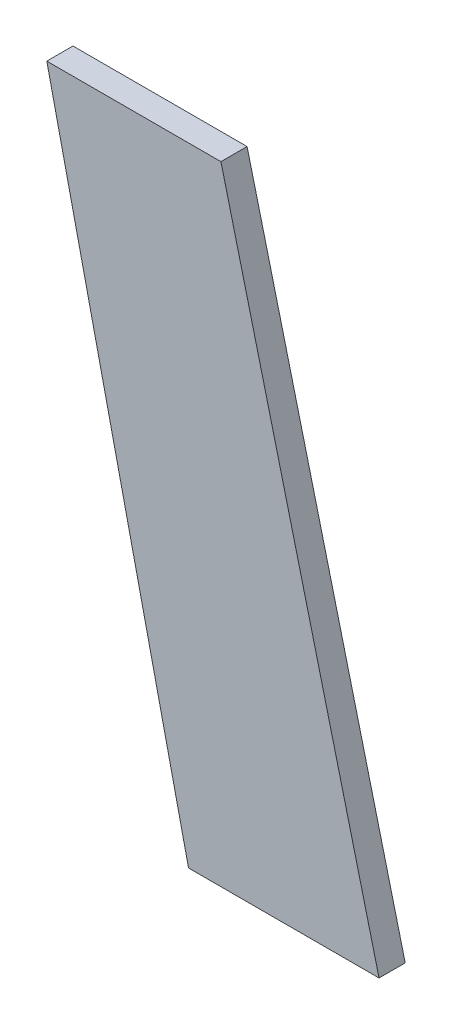
ISO-10303-21;
HEADER;
FILE_DESCRIPTION(('STEP AP214'),'2;1');
FILE_NAME('part.step','',(''),(''),'','','');
FILE_SCHEMA(('AUTOMOTIVE_DESIGN { 1 0 10303 214 1 1 1 1 }'));
ENDSEC;
DATA;
#1=APPLICATION_CONTEXT('core data for automotive mechanical design processes');
#2=APPLICATION_PROTOCOL_DEFINITION('international standard','automotive_design',2000,#1);
#3=PRODUCT_CONTEXT('',#1,'mechanical');
#4=PRODUCT('Part','Part','',(#3));
#5=PRODUCT_RELATED_PRODUCT_CATEGORY('part','',(#4));
#6=PRODUCT_DEFINITION_FORMATION('','',#4);
#7=PRODUCT_DEFINITION_CONTEXT('part definition',#1,'design');
#8=PRODUCT_DEFINITION('design','',#6,#7);
#9=PRODUCT_DEFINITION_SHAPE('','',#8);
#10=(LENGTH_UNIT() NAMED_UNIT(*) SI_UNIT(.MILLI.,.METRE.));
#11=(NAMED_UNIT(*) PLANE_ANGLE_UNIT() SI_UNIT($,.RADIAN.));
#12=(NAMED_UNIT(*) SI_UNIT($,.STERADIAN.) SOLID_ANGLE_UNIT());
#13=UNCERTAINTY_MEASURE_WITH_UNIT(LENGTH_MEASURE(1.E-05),#10,'distance_accuracy_value','');
#14=(GEOMETRIC_REPRESENTATION_CONTEXT(3) GLOBAL_UNCERTAINTY_ASSIGNED_CONTEXT((#13)) GLOBAL_UNIT_ASSIGNED_CONTEXT((#10,
#11,#12)) REPRESENTATION_CONTEXT('',''));
#15=CARTESIAN_POINT('',(0.,0.,0.));
#16=DIRECTION('',(0.,0.,1.));
#17=DIRECTION('',(1.,0.,0.));
#18=AXIS2_PLACEMENT_3D('',#15,#16,#17);
#19=CARTESIAN_POINT('',(16.5064102564092,-12.5,0.5));
#20=DIRECTION('',(0.,1.,0.));
#21=DIRECTION('',(0.,0.,1.));
#22=AXIS2_PLACEMENT_3D('',#19,#20,#21);
#23=PLANE('',#22);
#24=DIRECTION('',(-1.,0.,0.));
#25=VECTOR('',#24,1.);
#26=CARTESIAN_POINT('',(16.5064102564092,-12.5,1.));
#27=LINE('',#26,#25);
#28=CARTESIAN_POINT('',(16.5064102564092,-12.5,1.));
#29=VERTEX_POINT('',#28);
#30=CARTESIAN_POINT('',(12.8655849358964,-12.5,1.));
#31=VERTEX_POINT('',#30);
#32=EDGE_CURVE('E98',#29,#31,#27,.T.);
#33=ORIENTED_EDGE('',*,*,#32,.T.);
#34=DIRECTION('',(0.,0.,1.));
#35=VECTOR('',#34,1.);
#36=CARTESIAN_POINT('',(12.8655849358964,-12.5,0.5));
#37=LINE('',#36,#35);
#38=CARTESIAN_POINT('',(12.8655849358964,-12.5,0.5));
#39=VERTEX_POINT('',#38);
#40=EDGE_CURVE('E81',#39,#31,#37,.T.);
#41=ORIENTED_EDGE('',*,*,#40,.F.);
#42=DIRECTION('',(-1.,0.,0.));
#43=VECTOR('',#42,1.);
#44=CARTESIAN_POINT('',(16.5064102564092,-12.5,0.5));
#45=LINE('',#44,#43);
#46=CARTESIAN_POINT('',(16.5064102564092,-12.5,0.5));
#47=VERTEX_POINT('',#46);
#48=EDGE_CURVE('E93',#47,#39,#45,.T.);
#49=ORIENTED_EDGE('',*,*,#48,.F.);
#50=DIRECTION('',(0.,0.,1.));
#51=VECTOR('',#50,1.);
#52=CARTESIAN_POINT('',(16.5064102564092,-12.5,0.5));
#53=LINE('',#52,#51);
#54=EDGE_CURVE('E102',#47,#29,#53,.T.);
#55=ORIENTED_EDGE('',*,*,#54,.T.);
#56=EDGE_LOOP('',(#33,#41,#49,#55));
#57=FACE_BOUND('',#56,.T.);
#58=ADVANCED_FACE('F39',(#57),#23,.F.);
#59=CARTESIAN_POINT('',(8.58165516531608,6.47238776818213,0.5));
#60=DIRECTION('',(0.,0.,1.));
#61=DIRECTION('',(1.,0.,0.));
#62=AXIS2_PLACEMENT_3D('',#59,#60,#61);
#63=PLANE('',#62);
#64=DIRECTION('',(-0.220169673669664,0.975461590630914,0.));
#65=VECTOR('',#64,1.);
#66=CARTESIAN_POINT('',(12.8655849358964,-12.5,0.5));
#67=LINE('',#66,#65);
#68=CARTESIAN_POINT('',(10.1570866111934,-0.5,0.5));
#69=VERTEX_POINT('',#68);
#70=EDGE_CURVE('E105',#39,#69,#67,.T.);
#71=ORIENTED_EDGE('',*,*,#70,.T.);
#72=DIRECTION('',(1.,0.,0.));
#73=VECTOR('',#72,1.);
#74=CARTESIAN_POINT('',(8.58165516531608,-0.5,0.499999999999922));
#75=LINE('',#74,#73);
#76=CARTESIAN_POINT('',(13.4847756410246,-0.500000000000002,0.500000000000082));
#77=VERTEX_POINT('',#76);
#78=EDGE_CURVE('E76',#69,#77,#75,.T.);
#79=ORIENTED_EDGE('',*,*,#78,.T.);
#80=DIRECTION('',(0.244180745185394,-0.969729737442709,0.));
#81=VECTOR('',#80,1.);
#82=CARTESIAN_POINT('',(10.2113381410246,12.5,0.5));
#83=LINE('',#82,#81);
#84=EDGE_CURVE('E43',#77,#47,#83,.T.);
#85=ORIENTED_EDGE('',*,*,#84,.T.);
#86=ORIENTED_EDGE('',*,*,#48,.T.);
#87=EDGE_LOOP('',(#71,#79,#85,#86));
#88=FACE_BOUND('',#87,.T.);
#89=ADVANCED_FACE('F111',(#88),#63,.F.);
#90=CARTESIAN_POINT('',(12.8655849358964,-12.5,0.5));
#91=DIRECTION('',(0.975461590630914,0.220169673669664,0.));
#92=DIRECTION('',(-0.220169673669664,0.975461590630915,0.));
#93=AXIS2_PLACEMENT_3D('',#90,#91,#92);
#94=PLANE('',#93);
#95=DIRECTION('',(-0.220169673669664,0.975461590630914,0.));
#96=VECTOR('',#95,1.);
#97=CARTESIAN_POINT('',(12.8655849358964,-12.5,1.));
#98=LINE('',#97,#96);
#99=CARTESIAN_POINT('',(10.1570866111934,-0.5,1.));
#100=VERTEX_POINT('',#99);
#101=EDGE_CURVE('E84',#31,#100,#98,.T.);
#102=ORIENTED_EDGE('',*,*,#101,.T.);
#103=DIRECTION('',(0.,0.,-1.));
#104=VECTOR('',#103,1.);
#105=CARTESIAN_POINT('',(10.1570866111934,-0.5,0.5));
#106=LINE('',#105,#104);
#107=EDGE_CURVE('E78',#100,#69,#106,.T.);
#108=ORIENTED_EDGE('',*,*,#107,.T.);
#109=ORIENTED_EDGE('',*,*,#70,.F.);
#110=ORIENTED_EDGE('',*,*,#40,.T.);
#111=EDGE_LOOP('',(#102,#108,#109,#110));
#112=FACE_BOUND('',#111,.T.);
#113=ADVANCED_FACE('F91',(#112),#94,.F.);
#114=CARTESIAN_POINT('',(10.2113381410246,12.5,0.5));
#115=DIRECTION('',(-0.969729737442709,-0.244180745185394,0.));
#116=DIRECTION('',(0.244180745185394,-0.969729737442709,0.));
#117=AXIS2_PLACEMENT_3D('',#114,#115,#116);
#118=PLANE('',#117);
#119=ORIENTED_EDGE('',*,*,#84,.F.);
#120=DIRECTION('',(0.,0.,1.));
#121=VECTOR('',#120,1.);
#122=CARTESIAN_POINT('',(13.4847756410246,-0.5,0.5));
#123=LINE('',#122,#121);
#124=CARTESIAN_POINT('',(13.4847756410246,-0.5,1.));
#125=VERTEX_POINT('',#124);
#126=EDGE_CURVE('E60',#77,#125,#123,.T.);
#127=ORIENTED_EDGE('',*,*,#126,.T.);
#128=DIRECTION('',(0.244180745185394,-0.969729737442709,0.));
#129=VECTOR('',#128,1.);
#130=CARTESIAN_POINT('',(10.2113381410246,12.5,1.));
#131=LINE('',#130,#129);
#132=EDGE_CURVE('E47',#125,#29,#131,.T.);
#133=ORIENTED_EDGE('',*,*,#132,.T.);
#134=ORIENTED_EDGE('',*,*,#54,.F.);
#135=EDGE_LOOP('',(#119,#127,#133,#134));
#136=FACE_BOUND('',#135,.T.);
#137=ADVANCED_FACE('F106',(#136),#118,.F.);
#138=CARTESIAN_POINT('',(8.58165516531608,6.47238776818213,1.));
#139=DIRECTION('',(0.,0.,1.));
#140=DIRECTION('',(1.,0.,0.));
#141=AXIS2_PLACEMENT_3D('',#138,#139,#140);
#142=PLANE('',#141);
#143=ORIENTED_EDGE('',*,*,#132,.F.);
#144=DIRECTION('',(-1.,0.,0.));
#145=VECTOR('',#144,1.);
#146=CARTESIAN_POINT('',(-17.,-0.5,1.));
#147=LINE('',#146,#145);
#148=EDGE_CURVE('E11',#125,#100,#147,.T.);
#149=ORIENTED_EDGE('',*,*,#148,.T.);
#150=ORIENTED_EDGE('',*,*,#101,.F.);
#151=ORIENTED_EDGE('',*,*,#32,.F.);
#152=EDGE_LOOP('',(#143,#149,#150,#151));
#153=FACE_BOUND('',#152,.T.);
#154=ADVANCED_FACE('F41',(#153),#142,.T.);
#155=CARTESIAN_POINT('',(-17.,-0.5,1.));
#156=DIRECTION('',(0.,-1.,0.));
#157=DIRECTION('',(0.,0.,-1.));
#158=AXIS2_PLACEMENT_3D('',#155,#156,#157);
#159=PLANE('',#158);
#160=ORIENTED_EDGE('',*,*,#78,.F.);
#161=ORIENTED_EDGE('',*,*,#107,.F.);
#162=ORIENTED_EDGE('',*,*,#148,.F.);
#163=ORIENTED_EDGE('',*,*,#126,.F.);
#164=EDGE_LOOP('',(#160,#161,#162,#163));
#165=FACE_BOUND('',#164,.T.);
#166=ADVANCED_FACE('F77',(#165),#159,.F.);
#167=CLOSED_SHELL('',(#58,#89,#113,#137,#154,#166));
#168=MANIFOLD_SOLID_BREP('B2',#167);
#169=ADVANCED_BREP_SHAPE_REPRESENTATION('',(#18,#168),#14);
#170=SHAPE_DEFINITION_REPRESENTATION(#9,#169);
ENDSEC;
END-ISO-10303-21;
